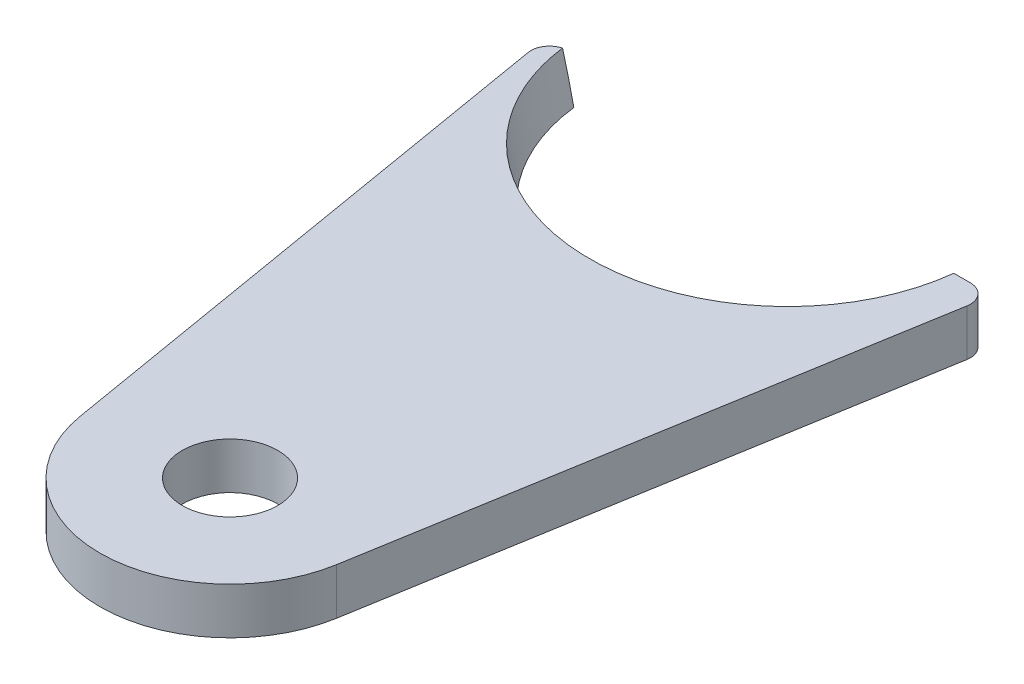
ISO-10303-21;
HEADER;
FILE_DESCRIPTION(('STEP AP214'),'2;1');
FILE_NAME('part.step','',(''),(''),'','','');
FILE_SCHEMA(('AUTOMOTIVE_DESIGN { 1 0 10303 214 1 1 1 1 }'));
ENDSEC;
DATA;
#1=APPLICATION_CONTEXT('core data for automotive mechanical design processes');
#2=APPLICATION_PROTOCOL_DEFINITION('international standard','automotive_design',2000,#1);
#3=PRODUCT_CONTEXT('',#1,'mechanical');
#4=PRODUCT('Part','Part','',(#3));
#5=PRODUCT_RELATED_PRODUCT_CATEGORY('part','',(#4));
#6=PRODUCT_DEFINITION_FORMATION('','',#4);
#7=PRODUCT_DEFINITION_CONTEXT('part definition',#1,'design');
#8=PRODUCT_DEFINITION('design','',#6,#7);
#9=PRODUCT_DEFINITION_SHAPE('','',#8);
#10=(LENGTH_UNIT() NAMED_UNIT(*) SI_UNIT(.MILLI.,.METRE.));
#11=(NAMED_UNIT(*) PLANE_ANGLE_UNIT() SI_UNIT($,.RADIAN.));
#12=(NAMED_UNIT(*) SI_UNIT($,.STERADIAN.) SOLID_ANGLE_UNIT());
#13=UNCERTAINTY_MEASURE_WITH_UNIT(LENGTH_MEASURE(1.E-05),#10,'distance_accuracy_value','');
#14=(GEOMETRIC_REPRESENTATION_CONTEXT(3) GLOBAL_UNCERTAINTY_ASSIGNED_CONTEXT((#13)) GLOBAL_UNIT_ASSIGNED_CONTEXT((#10,
#11,#12)) REPRESENTATION_CONTEXT('',''));
#15=CARTESIAN_POINT('',(0.,0.,0.));
#16=DIRECTION('',(0.,0.,1.));
#17=DIRECTION('',(1.,0.,0.));
#18=AXIS2_PLACEMENT_3D('',#15,#16,#17);
#19=CARTESIAN_POINT('',(0.,3.175,-36.83));
#20=DIRECTION('',(0.,0.,1.));
#21=DIRECTION('',(-1.,0.,0.));
#22=AXIS2_PLACEMENT_3D('',#19,#20,#21);
#23=PLANE('',#22);
#24=DIRECTION('',(1.,0.,0.));
#25=VECTOR('',#24,1.);
#26=CARTESIAN_POINT('',(0.,0.,-36.83));
#27=LINE('',#26,#25);
#28=CARTESIAN_POINT('',(13.3594729890803,0.,-36.83));
#29=VERTEX_POINT('',#28);
#30=CARTESIAN_POINT('',(13.7373742029562,0.,-36.83));
#31=VERTEX_POINT('',#30);
#32=EDGE_CURVE('E134',#29,#31,#27,.T.);
#33=ORIENTED_EDGE('',*,*,#32,.F.);
#34=CARTESIAN_POINT('',(15.4654164635902,-66.1988718553639,-36.83));
#35=DIRECTION('',(0.,0.,-1.));
#36=DIRECTION('',(0.227494846304663,-0.973779284491521,0.));
#37=AXIS2_PLACEMENT_3D('',#34,#35,#36);
#38=ELLIPSE('',#37,620.584173374647,13.081);
#39=CARTESIAN_POINT('',(12.6101085849822,3.175,-36.83));
#40=VERTEX_POINT('',#39);
#41=EDGE_CURVE('E117',#29,#40,#38,.F.);
#42=ORIENTED_EDGE('',*,*,#41,.T.);
#43=DIRECTION('',(1.,0.,0.));
#44=VECTOR('',#43,1.);
#45=CARTESIAN_POINT('',(0.,3.175,-36.83));
#46=LINE('',#45,#44);
#47=CARTESIAN_POINT('',(13.7373742029562,3.175,-36.83));
#48=VERTEX_POINT('',#47);
#49=EDGE_CURVE('E205',#40,#48,#46,.T.);
#50=ORIENTED_EDGE('',*,*,#49,.T.);
#51=DIRECTION('',(0.,-1.,0.));
#52=VECTOR('',#51,1.);
#53=CARTESIAN_POINT('',(13.7373742029562,3.175,-36.83));
#54=LINE('',#53,#52);
#55=EDGE_CURVE('E11',#31,#48,#54,.F.);
#56=ORIENTED_EDGE('',*,*,#55,.F.);
#57=EDGE_LOOP('',(#33,#42,#50,#56));
#58=FACE_BOUND('',#57,.T.);
#59=ADVANCED_FACE('F47',(#58),#23,.F.);
#60=CARTESIAN_POINT('',(-8.76571505055445,3.175,1.48133036574667));
#61=DIRECTION('',(-0.986019690726035,0.,0.166628837541807));
#62=DIRECTION('',(-0.166628837541807,0.,-0.986019690726035));
#63=AXIS2_PLACEMENT_3D('',#60,#61,#62);
#64=PLANE('',#63);
#65=DIRECTION('',(0.166628837541807,0.,0.986019690726035));
#66=VECTOR('',#65,1.);
#67=CARTESIAN_POINT('',(-8.76571505055445,0.,1.48133036574667));
#68=LINE('',#67,#66);
#69=CARTESIAN_POINT('',(-14.9896192101783,0.,-35.3483813763219));
#70=VERTEX_POINT('',#69);
#71=CARTESIAN_POINT('',(-8.76571505055445,0.,1.48133036574667));
#72=VERTEX_POINT('',#71);
#73=EDGE_CURVE('E140',#70,#72,#68,.T.);
#74=ORIENTED_EDGE('',*,*,#73,.T.);
#75=DIRECTION('',(0.,-1.,0.));
#76=VECTOR('',#75,1.);
#77=CARTESIAN_POINT('',(-8.76571505055445,3.175,1.48133036574667));
#78=LINE('',#77,#76);
#79=CARTESIAN_POINT('',(-8.76571505055445,3.175,1.48133036574667));
#80=VERTEX_POINT('',#79);
#81=EDGE_CURVE('E132',#80,#72,#78,.T.);
#82=ORIENTED_EDGE('',*,*,#81,.F.);
#83=DIRECTION('',(0.166628837541807,0.,0.986019690726035));
#84=VECTOR('',#83,1.);
#85=CARTESIAN_POINT('',(-8.76571505055445,3.175,1.48133036574667));
#86=LINE('',#85,#84);
#87=CARTESIAN_POINT('',(-14.9896192101783,3.175,-35.3483813763219));
#88=VERTEX_POINT('',#87);
#89=EDGE_CURVE('E194',#88,#80,#86,.T.);
#90=ORIENTED_EDGE('',*,*,#89,.F.);
#91=DIRECTION('',(0.,-1.,0.));
#92=VECTOR('',#91,1.);
#93=CARTESIAN_POINT('',(-14.9896192101783,3.175,-35.3483813763219));
#94=LINE('',#93,#92);
#95=EDGE_CURVE('E152',#70,#88,#94,.F.);
#96=ORIENTED_EDGE('',*,*,#95,.F.);
#97=EDGE_LOOP('',(#74,#82,#90,#96));
#98=FACE_BOUND('',#97,.T.);
#99=ADVANCED_FACE('F180',(#98),#64,.T.);
#100=CARTESIAN_POINT('',(-13.7373742029562,1.69845635367923,-36.83));
#101=VERTEX_POINT('',#100);
#102=CARTESIAN_POINT('',(-13.3449805821177,0.,-36.83));
#103=VERTEX_POINT('',#102);
#104=EDGE_CURVE('E115',#101,#103,#38,.F.);
#105=ORIENTED_EDGE('',*,*,#104,.T.);
#106=CARTESIAN_POINT('',(-13.7373742029562,0.,-36.83));
#107=VERTEX_POINT('',#106);
#108=EDGE_CURVE('E123',#107,#103,#27,.T.);
#109=ORIENTED_EDGE('',*,*,#108,.F.);
#110=DIRECTION('',(0.,-1.,0.));
#111=VECTOR('',#110,1.);
#112=CARTESIAN_POINT('',(-13.7373742029562,0.,-36.83));
#113=LINE('',#112,#111);
#114=EDGE_CURVE('E136',#101,#107,#113,.T.);
#115=ORIENTED_EDGE('',*,*,#114,.F.);
#116=EDGE_LOOP('',(#105,#109,#115));
#117=FACE_BOUND('',#116,.T.);
#118=ADVANCED_FACE('F135',(#117),#23,.F.);
#119=CARTESIAN_POINT('',(8.76571505055446,3.175,1.48133036574667));
#120=DIRECTION('',(-0.986019690726035,0.,-0.166628837541808));
#121=DIRECTION('',(0.166628837541808,0.,-0.986019690726035));
#122=AXIS2_PLACEMENT_3D('',#119,#120,#121);
#123=PLANE('',#122);
#124=DIRECTION('',(-0.166628837541808,0.,0.986019690726035));
#125=VECTOR('',#124,1.);
#126=CARTESIAN_POINT('',(8.76571505055446,3.175,1.48133036574667));
#127=LINE('',#126,#125);
#128=CARTESIAN_POINT('',(14.9896192101783,3.175,-35.3483813763219));
#129=VERTEX_POINT('',#128);
#130=CARTESIAN_POINT('',(8.76571505055445,3.175,1.48133036574667));
#131=VERTEX_POINT('',#130);
#132=EDGE_CURVE('E202',#129,#131,#127,.T.);
#133=ORIENTED_EDGE('',*,*,#132,.T.);
#134=DIRECTION('',(0.,-1.,0.));
#135=VECTOR('',#134,1.);
#136=CARTESIAN_POINT('',(8.76571505055445,3.175,1.48133036574667));
#137=LINE('',#136,#135);
#138=CARTESIAN_POINT('',(8.76571505055445,0.,1.48133036574667));
#139=VERTEX_POINT('',#138);
#140=EDGE_CURVE('E209',#131,#139,#137,.T.);
#141=ORIENTED_EDGE('',*,*,#140,.T.);
#142=DIRECTION('',(-0.166628837541808,0.,0.986019690726035));
#143=VECTOR('',#142,1.);
#144=CARTESIAN_POINT('',(8.76571505055446,0.,1.48133036574667));
#145=LINE('',#144,#143);
#146=CARTESIAN_POINT('',(14.9896192101783,0.,-35.3483813763219));
#147=VERTEX_POINT('',#146);
#148=EDGE_CURVE('E131',#147,#139,#145,.T.);
#149=ORIENTED_EDGE('',*,*,#148,.F.);
#150=DIRECTION('',(0.,-1.,0.));
#151=VECTOR('',#150,1.);
#152=CARTESIAN_POINT('',(14.9896192101783,3.175,-35.3483813763219));
#153=LINE('',#152,#151);
#154=EDGE_CURVE('E55',#129,#147,#153,.T.);
#155=ORIENTED_EDGE('',*,*,#154,.F.);
#156=EDGE_LOOP('',(#133,#141,#149,#155));
#157=FACE_BOUND('',#156,.T.);
#158=ADVANCED_FACE('F179',(#157),#123,.F.);
#159=CARTESIAN_POINT('',(0.,3.175,0.));
#160=DIRECTION('',(0.,-1.,0.));
#161=DIRECTION('',(0.,0.,1.));
#162=AXIS2_PLACEMENT_3D('',#159,#160,#161);
#163=CYLINDRICAL_SURFACE('',#162,8.89);
#164=CARTESIAN_POINT('',(0.,0.,0.));
#165=DIRECTION('',(0.,-1.,0.));
#166=DIRECTION('',(0.,0.,-1.));
#167=AXIS2_PLACEMENT_3D('',#164,#165,#166);
#168=CIRCLE('',#167,8.89);
#169=EDGE_CURVE('E214',#139,#72,#168,.T.);
#170=ORIENTED_EDGE('',*,*,#169,.F.);
#171=ORIENTED_EDGE('',*,*,#140,.F.);
#172=CARTESIAN_POINT('',(0.,3.175,0.));
#173=DIRECTION('',(0.,-1.,0.));
#174=DIRECTION('',(0.,0.,-1.));
#175=AXIS2_PLACEMENT_3D('',#172,#173,#174);
#176=CIRCLE('',#175,8.89);
#177=EDGE_CURVE('E218',#131,#80,#176,.T.);
#178=ORIENTED_EDGE('',*,*,#177,.T.);
#179=ORIENTED_EDGE('',*,*,#81,.T.);
#180=EDGE_LOOP('',(#170,#171,#178,#179));
#181=FACE_BOUND('',#180,.T.);
#182=ADVANCED_FACE('F185',(#181),#163,.T.);
#183=CARTESIAN_POINT('',(0.,3.175,0.));
#184=DIRECTION('',(0.,-1.,0.));
#185=DIRECTION('',(0.,0.,1.));
#186=AXIS2_PLACEMENT_3D('',#183,#184,#185);
#187=CYLINDRICAL_SURFACE('',#186,3.2639);
#188=CARTESIAN_POINT('',(0.,3.175,0.));
#189=DIRECTION('',(0.,-1.,0.));
#190=DIRECTION('',(0.,0.,-1.));
#191=AXIS2_PLACEMENT_3D('',#188,#189,#190);
#192=CIRCLE('',#191,3.2639);
#193=CARTESIAN_POINT('',(0.,3.175,-3.2639));
#194=VERTEX_POINT('',#193);
#195=EDGE_CURVE('E206',#194,#194,#192,.T.);
#196=ORIENTED_EDGE('',*,*,#195,.F.);
#197=EDGE_LOOP('',(#196));
#198=FACE_BOUND('',#197,.T.);
#199=CARTESIAN_POINT('',(0.,0.,0.));
#200=DIRECTION('',(0.,-1.,0.));
#201=DIRECTION('',(0.,0.,-1.));
#202=AXIS2_PLACEMENT_3D('',#199,#200,#201);
#203=CIRCLE('',#202,3.2639);
#204=CARTESIAN_POINT('',(0.,0.,-3.2639));
#205=VERTEX_POINT('',#204);
#206=EDGE_CURVE('E137',#205,#205,#203,.T.);
#207=ORIENTED_EDGE('',*,*,#206,.T.);
#208=EDGE_LOOP('',(#207));
#209=FACE_BOUND('',#208,.T.);
#210=ADVANCED_FACE('F172',(#198,#209),#187,.F.);
#211=CARTESIAN_POINT('',(0.,3.175,0.));
#212=DIRECTION('',(0.,1.,0.));
#213=DIRECTION('',(0.,0.,-1.));
#214=AXIS2_PLACEMENT_3D('',#211,#212,#213);
#215=PLANE('',#214);
#216=ORIENTED_EDGE('',*,*,#89,.T.);
#217=ORIENTED_EDGE('',*,*,#177,.F.);
#218=ORIENTED_EDGE('',*,*,#132,.F.);
#219=CARTESIAN_POINT('',(13.7373742029562,3.175,-35.56));
#220=DIRECTION('',(0.,-1.,0.));
#221=DIRECTION('',(0.,0.,-1.));
#222=AXIS2_PLACEMENT_3D('',#219,#220,#221);
#223=CIRCLE('',#222,1.27);
#224=EDGE_CURVE('E61',#48,#129,#223,.T.);
#225=ORIENTED_EDGE('',*,*,#224,.F.);
#226=ORIENTED_EDGE('',*,*,#49,.F.);
#227=CARTESIAN_POINT('',(-0.741745227610072,3.17500000000001,-38.3320076797842));
#228=DIRECTION('',(0.,-1.,0.));
#229=DIRECTION('',(0.995733086920544,0.,0.0922801149310388));
#230=AXIS2_PLACEMENT_3D('',#227,#228,#229);
#231=ELLIPSE('',#230,13.4362140879871,13.081);
#232=CARTESIAN_POINT('',(-14.0727534176053,3.17500000000001,-36.7849166430256));
#233=VERTEX_POINT('',#232);
#234=EDGE_CURVE('E204',#233,#40,#231,.F.);
#235=ORIENTED_EDGE('',*,*,#234,.F.);
#236=CARTESIAN_POINT('',(-13.7373742029562,3.175,-35.56));
#237=DIRECTION('',(0.,-1.,0.));
#238=DIRECTION('',(0.,0.,-1.));
#239=AXIS2_PLACEMENT_3D('',#236,#237,#238);
#240=CIRCLE('',#239,1.27);
#241=EDGE_CURVE('E156',#88,#233,#240,.T.);
#242=ORIENTED_EDGE('',*,*,#241,.F.);
#243=EDGE_LOOP('',(#216,#217,#218,#225,#226,#235,#242));
#244=FACE_BOUND('',#243,.T.);
#245=ORIENTED_EDGE('',*,*,#195,.T.);
#246=EDGE_LOOP('',(#245));
#247=FACE_BOUND('',#246,.T.);
#248=ADVANCED_FACE('F174',(#244,#247),#215,.T.);
#249=CARTESIAN_POINT('',(0.,0.,0.));
#250=DIRECTION('',(0.,1.,0.));
#251=DIRECTION('',(0.,0.,-1.));
#252=AXIS2_PLACEMENT_3D('',#249,#250,#251);
#253=PLANE('',#252);
#254=ORIENTED_EDGE('',*,*,#108,.T.);
#255=CARTESIAN_POINT('',(1.80411241501588E-13,0.,-38.2632660302874));
#256=DIRECTION('',(0.,-1.,0.));
#257=DIRECTION('',(0.995733086920544,0.,0.0922801149310388));
#258=AXIS2_PLACEMENT_3D('',#255,#256,#257);
#259=ELLIPSE('',#258,13.4362140879871,13.081);
#260=EDGE_CURVE('E111',#103,#29,#259,.F.);
#261=ORIENTED_EDGE('',*,*,#260,.T.);
#262=ORIENTED_EDGE('',*,*,#32,.T.);
#263=CARTESIAN_POINT('',(13.7373742029562,0.,-35.56));
#264=DIRECTION('',(0.,-1.,0.));
#265=DIRECTION('',(0.,0.,-1.));
#266=AXIS2_PLACEMENT_3D('',#263,#264,#265);
#267=CIRCLE('',#266,1.27);
#268=EDGE_CURVE('E146',#147,#31,#267,.F.);
#269=ORIENTED_EDGE('',*,*,#268,.F.);
#270=ORIENTED_EDGE('',*,*,#148,.T.);
#271=ORIENTED_EDGE('',*,*,#169,.T.);
#272=ORIENTED_EDGE('',*,*,#73,.F.);
#273=CARTESIAN_POINT('',(-13.7373742029562,0.,-35.56));
#274=DIRECTION('',(0.,-1.,0.));
#275=DIRECTION('',(0.,0.,-1.));
#276=AXIS2_PLACEMENT_3D('',#273,#274,#275);
#277=CIRCLE('',#276,1.27);
#278=EDGE_CURVE('E127',#107,#70,#277,.F.);
#279=ORIENTED_EDGE('',*,*,#278,.F.);
#280=EDGE_LOOP('',(#254,#261,#262,#269,#270,#271,#272,#279));
#281=FACE_BOUND('',#280,.T.);
#282=ORIENTED_EDGE('',*,*,#206,.F.);
#283=EDGE_LOOP('',(#282));
#284=FACE_BOUND('',#283,.T.);
#285=ADVANCED_FACE('F124',(#281,#284),#253,.F.);
#286=CARTESIAN_POINT('',(-38.3279361291009,164.060640608313,-41.8153287241177));
#287=DIRECTION('',(0.22744430222249,-0.973562933303906,0.0210785265903051));
#288=DIRECTION('',(-0.0922801149310373,0.,0.995733086920544));
#289=AXIS2_PLACEMENT_3D('',#286,#287,#288);
#290=CYLINDRICAL_SURFACE('',#289,13.081);
#291=ORIENTED_EDGE('',*,*,#234,.T.);
#292=ORIENTED_EDGE('',*,*,#41,.F.);
#293=ORIENTED_EDGE('',*,*,#260,.F.);
#294=ORIENTED_EDGE('',*,*,#104,.F.);
#295=CARTESIAN_POINT('',(-14.0727534176053,3.17500000000001,-36.7849166430256));
#296=CARTESIAN_POINT('',(-14.0178249765465,2.92891804964771,-36.7999158195758));
#297=CARTESIAN_POINT('',(-13.9624124881377,2.68283177064654,-36.8111723542654));
#298=CARTESIAN_POINT('',(-13.8506194165886,2.19065055520631,-36.8262001399278));
#299=CARTESIAN_POINT('',(-13.7942388334476,1.94455561876725,-36.8299713908963));
#300=CARTESIAN_POINT('',(-13.7373742029562,1.69845635367931,-36.83));
#301=B_SPLINE_CURVE_WITH_KNOTS('',3,(#295,#296,#297,#298,#299,#300),.UNSPECIFIED.,.F.,.F.,(4,2,
4),(0.,0.75749679300813,1.51499358644765),.UNSPECIFIED.);
#302=EDGE_CURVE('E159',#233,#101,#301,.T.);
#303=ORIENTED_EDGE('',*,*,#302,.F.);
#304=EDGE_LOOP('',(#291,#292,#293,#294,#303));
#305=FACE_BOUND('',#304,.T.);
#306=ADVANCED_FACE('F113',(#305),#290,.F.);
#307=CARTESIAN_POINT('',(-13.7373742029562,3.175,-35.56));
#308=DIRECTION('',(0.,1.,0.));
#309=DIRECTION('',(0.,0.,-1.));
#310=AXIS2_PLACEMENT_3D('',#307,#308,#309);
#311=CYLINDRICAL_SURFACE('',#310,1.27);
#312=ORIENTED_EDGE('',*,*,#241,.T.);
#313=ORIENTED_EDGE('',*,*,#302,.T.);
#314=ORIENTED_EDGE('',*,*,#114,.T.);
#315=ORIENTED_EDGE('',*,*,#278,.T.);
#316=ORIENTED_EDGE('',*,*,#95,.T.);
#317=EDGE_LOOP('',(#312,#313,#314,#315,#316));
#318=FACE_BOUND('',#317,.T.);
#319=ADVANCED_FACE('F165',(#318),#311,.T.);
#320=CARTESIAN_POINT('',(13.7373742029562,3.175,-35.56));
#321=DIRECTION('',(0.,-1.,0.));
#322=DIRECTION('',(0.,0.,1.));
#323=AXIS2_PLACEMENT_3D('',#320,#321,#322);
#324=CYLINDRICAL_SURFACE('',#323,1.27);
#325=ORIENTED_EDGE('',*,*,#224,.T.);
#326=ORIENTED_EDGE('',*,*,#154,.T.);
#327=ORIENTED_EDGE('',*,*,#268,.T.);
#328=ORIENTED_EDGE('',*,*,#55,.T.);
#329=EDGE_LOOP('',(#325,#326,#327,#328));
#330=FACE_BOUND('',#329,.T.);
#331=ADVANCED_FACE('F49',(#330),#324,.T.);
#332=CLOSED_SHELL('',(#59,#99,#118,#158,#182,#210,#248,#285,#306,#319,#331));
#333=MANIFOLD_SOLID_BREP('B2',#332);
#334=ADVANCED_BREP_SHAPE_REPRESENTATION('',(#18,#333),#14);
#335=SHAPE_DEFINITION_REPRESENTATION(#9,#334);
ENDSEC;
END-ISO-10303-21;
